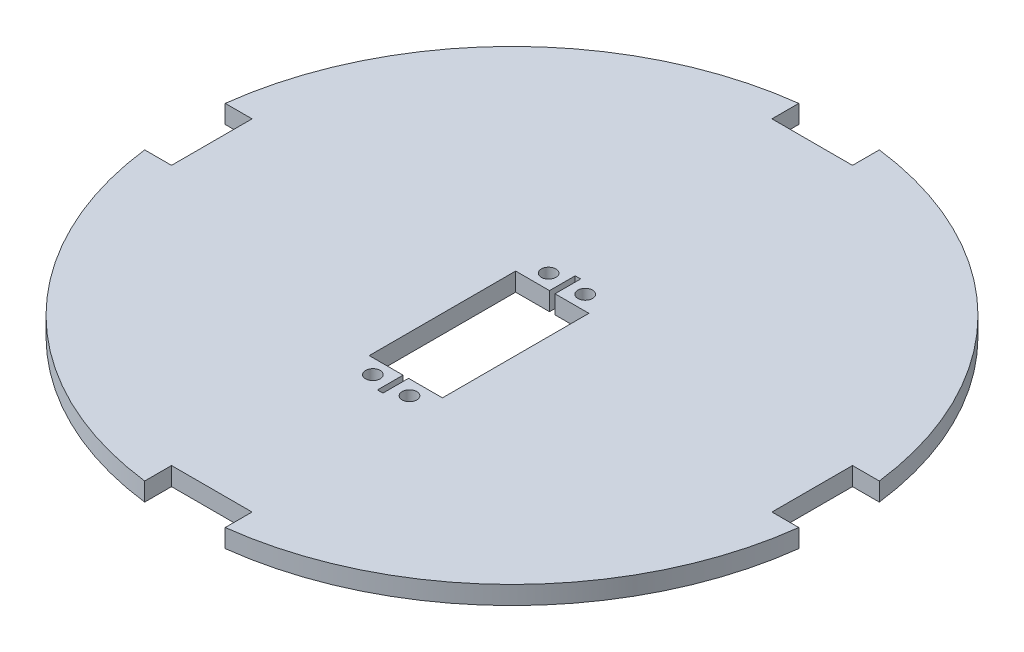
ISO-10303-21;
HEADER;
FILE_DESCRIPTION(('STEP AP214'),'2;1');
FILE_NAME('part.step','',(''),(''),'','','');
FILE_SCHEMA(('AUTOMOTIVE_DESIGN { 1 0 10303 214 1 1 1 1 }'));
ENDSEC;
DATA;
#1=APPLICATION_CONTEXT('core data for automotive mechanical design processes');
#2=APPLICATION_PROTOCOL_DEFINITION('international standard','automotive_design',2000,#1);
#3=PRODUCT_CONTEXT('',#1,'mechanical');
#4=PRODUCT('Part','Part','',(#3));
#5=PRODUCT_RELATED_PRODUCT_CATEGORY('part','',(#4));
#6=PRODUCT_DEFINITION_FORMATION('','',#4);
#7=PRODUCT_DEFINITION_CONTEXT('part definition',#1,'design');
#8=PRODUCT_DEFINITION('design','',#6,#7);
#9=PRODUCT_DEFINITION_SHAPE('','',#8);
#10=(LENGTH_UNIT() NAMED_UNIT(*) SI_UNIT(.MILLI.,.METRE.));
#11=(NAMED_UNIT(*) PLANE_ANGLE_UNIT() SI_UNIT($,.RADIAN.));
#12=(NAMED_UNIT(*) SI_UNIT($,.STERADIAN.) SOLID_ANGLE_UNIT());
#13=UNCERTAINTY_MEASURE_WITH_UNIT(LENGTH_MEASURE(1.E-05),#10,'distance_accuracy_value','');
#14=(GEOMETRIC_REPRESENTATION_CONTEXT(3) GLOBAL_UNCERTAINTY_ASSIGNED_CONTEXT((#13)) GLOBAL_UNIT_ASSIGNED_CONTEXT((#10,
#11,#12)) REPRESENTATION_CONTEXT('',''));
#15=CARTESIAN_POINT('',(0.,0.,0.));
#16=DIRECTION('',(0.,0.,1.));
#17=DIRECTION('',(1.,0.,0.));
#18=AXIS2_PLACEMENT_3D('',#15,#16,#17);
#19=CARTESIAN_POINT('',(0.,5.,0.));
#20=DIRECTION('',(0.,1.,0.));
#21=DIRECTION('',(0.,0.,1.));
#22=AXIS2_PLACEMENT_3D('',#19,#20,#21);
#23=PLANE('',#22);
#24=CARTESIAN_POINT('',(-5.,5.,33.));
#25=DIRECTION('',(0.,1.,0.));
#26=DIRECTION('',(0.,0.,1.));
#27=AXIS2_PLACEMENT_3D('',#24,#25,#26);
#28=CIRCLE('',#27,2.);
#29=CARTESIAN_POINT('',(-5.,5.,35.));
#30=VERTEX_POINT('',#29);
#31=EDGE_CURVE('E441',#30,#30,#28,.F.);
#32=ORIENTED_EDGE('',*,*,#31,.T.);
#33=EDGE_LOOP('',(#32));
#34=FACE_BOUND('',#33,.T.);
#35=DIRECTION('',(1.,0.,0.));
#36=VECTOR('',#35,1.);
#37=CARTESIAN_POINT('',(0.,5.,-11.));
#38=LINE('',#37,#36);
#39=CARTESIAN_POINT('',(0.749999999999998,5.,-11.));
#40=VERTEX_POINT('',#39);
#41=CARTESIAN_POINT('',(10.,5.,-11.));
#42=VERTEX_POINT('',#41);
#43=EDGE_CURVE('E388',#40,#42,#38,.T.);
#44=ORIENTED_EDGE('',*,*,#43,.T.);
#45=DIRECTION('',(0.,0.,1.));
#46=VECTOR('',#45,1.);
#47=CARTESIAN_POINT('',(10.,5.,0.));
#48=LINE('',#47,#46);
#49=CARTESIAN_POINT('',(10.,5.,29.));
#50=VERTEX_POINT('',#49);
#51=EDGE_CURVE('E207',#42,#50,#48,.T.);
#52=ORIENTED_EDGE('',*,*,#51,.T.);
#53=DIRECTION('',(1.,0.,0.));
#54=VECTOR('',#53,1.);
#55=CARTESIAN_POINT('',(0.,5.,29.));
#56=LINE('',#55,#54);
#57=CARTESIAN_POINT('',(0.750000000000012,5.,29.));
#58=VERTEX_POINT('',#57);
#59=EDGE_CURVE('E411',#58,#50,#56,.T.);
#60=ORIENTED_EDGE('',*,*,#59,.F.);
#61=DIRECTION('',(0.,0.,-1.));
#62=VECTOR('',#61,1.);
#63=CARTESIAN_POINT('',(0.74999999999997,5.,0.));
#64=LINE('',#63,#62);
#65=CARTESIAN_POINT('',(0.750000000000016,5.,36.));
#66=VERTEX_POINT('',#65);
#67=EDGE_CURVE('E417',#66,#58,#64,.T.);
#68=ORIENTED_EDGE('',*,*,#67,.F.);
#69=DIRECTION('',(1.,0.,0.));
#70=VECTOR('',#69,1.);
#71=CARTESIAN_POINT('',(0.,5.,36.));
#72=LINE('',#71,#70);
#73=CARTESIAN_POINT('',(-0.750000000000003,5.,36.));
#74=VERTEX_POINT('',#73);
#75=EDGE_CURVE('E414',#74,#66,#72,.T.);
#76=ORIENTED_EDGE('',*,*,#75,.F.);
#77=DIRECTION('',(0.,0.,-1.));
#78=VECTOR('',#77,1.);
#79=CARTESIAN_POINT('',(-0.749999999999999,5.,0.));
#80=LINE('',#79,#78);
#81=CARTESIAN_POINT('',(-0.750000000000003,5.,29.));
#82=VERTEX_POINT('',#81);
#83=EDGE_CURVE('E410',#74,#82,#80,.T.);
#84=ORIENTED_EDGE('',*,*,#83,.T.);
#85=CARTESIAN_POINT('',(-9.99999999999999,5.,29.));
#86=VERTEX_POINT('',#85);
#87=EDGE_CURVE('E407',#86,#82,#56,.T.);
#88=ORIENTED_EDGE('',*,*,#87,.F.);
#89=DIRECTION('',(0.,0.,1.));
#90=VECTOR('',#89,1.);
#91=CARTESIAN_POINT('',(-9.99999999999999,5.,0.));
#92=LINE('',#91,#90);
#93=CARTESIAN_POINT('',(-9.99999999999999,5.,-11.));
#94=VERTEX_POINT('',#93);
#95=EDGE_CURVE('E404',#94,#86,#92,.T.);
#96=ORIENTED_EDGE('',*,*,#95,.F.);
#97=CARTESIAN_POINT('',(-0.750000000000003,5.,-11.));
#98=VERTEX_POINT('',#97);
#99=EDGE_CURVE('E392',#94,#98,#38,.T.);
#100=ORIENTED_EDGE('',*,*,#99,.T.);
#101=DIRECTION('',(0.,0.,1.));
#102=VECTOR('',#101,1.);
#103=CARTESIAN_POINT('',(-0.750000000000001,5.,0.));
#104=LINE('',#103,#102);
#105=CARTESIAN_POINT('',(-0.750000000000003,5.,-18.));
#106=VERTEX_POINT('',#105);
#107=EDGE_CURVE('E398',#106,#98,#104,.T.);
#108=ORIENTED_EDGE('',*,*,#107,.F.);
#109=DIRECTION('',(1.,0.,0.));
#110=VECTOR('',#109,1.);
#111=CARTESIAN_POINT('',(0.,5.,-18.));
#112=LINE('',#111,#110);
#113=CARTESIAN_POINT('',(0.749999999999997,5.,-18.));
#114=VERTEX_POINT('',#113);
#115=EDGE_CURVE('E396',#106,#114,#112,.T.);
#116=ORIENTED_EDGE('',*,*,#115,.T.);
#117=DIRECTION('',(0.,0.,1.));
#118=VECTOR('',#117,1.);
#119=CARTESIAN_POINT('',(0.749999999999999,5.,0.));
#120=LINE('',#119,#118);
#121=EDGE_CURVE('E379',#114,#40,#120,.T.);
#122=ORIENTED_EDGE('',*,*,#121,.T.);
#123=EDGE_LOOP('',(#44,#52,#60,#68,#76,#84,#88,#96,#100,#108,#116,#122));
#124=FACE_BOUND('',#123,.T.);
#125=CARTESIAN_POINT('',(4.99999999999999,5.,33.));
#126=DIRECTION('',(0.,1.,0.));
#127=DIRECTION('',(0.,0.,1.));
#128=AXIS2_PLACEMENT_3D('',#125,#126,#127);
#129=CIRCLE('',#128,2.);
#130=CARTESIAN_POINT('',(4.99999999999999,5.,35.));
#131=VERTEX_POINT('',#130);
#132=EDGE_CURVE('E444',#131,#131,#129,.F.);
#133=ORIENTED_EDGE('',*,*,#132,.T.);
#134=EDGE_LOOP('',(#133));
#135=FACE_BOUND('',#134,.T.);
#136=DIRECTION('',(-1.,0.,0.));
#137=VECTOR('',#136,1.);
#138=CARTESIAN_POINT('',(-82.,5.,-10.9999999999997));
#139=LINE('',#138,#137);
#140=CARTESIAN_POINT('',(-82.,5.,-10.9999999999997));
#141=VERTEX_POINT('',#140);
#142=CARTESIAN_POINT('',(-89.3252483903628,5.,-10.9999999999997));
#143=VERTEX_POINT('',#142);
#144=EDGE_CURVE('E450',#141,#143,#139,.T.);
#145=ORIENTED_EDGE('',*,*,#144,.F.);
#146=DIRECTION('',(0.,0.,-1.));
#147=VECTOR('',#146,1.);
#148=CARTESIAN_POINT('',(-82.,5.,11.0000000000003));
#149=LINE('',#148,#147);
#150=CARTESIAN_POINT('',(-82.,5.,11.0000000000003));
#151=VERTEX_POINT('',#150);
#152=EDGE_CURVE('E456',#151,#141,#149,.T.);
#153=ORIENTED_EDGE('',*,*,#152,.F.);
#154=DIRECTION('',(1.,0.,0.));
#155=VECTOR('',#154,1.);
#156=CARTESIAN_POINT('',(-82.,5.,11.0000000000003));
#157=LINE('',#156,#155);
#158=CARTESIAN_POINT('',(-89.3252483903627,5.,11.0000000000003));
#159=VERTEX_POINT('',#158);
#160=EDGE_CURVE('E452',#159,#151,#157,.T.);
#161=ORIENTED_EDGE('',*,*,#160,.F.);
#162=CARTESIAN_POINT('',(0.,5.,0.));
#163=DIRECTION('',(0.,1.,0.));
#164=DIRECTION('',(0.,0.,1.));
#165=AXIS2_PLACEMENT_3D('',#162,#163,#164);
#166=CIRCLE('',#165,90.);
#167=CARTESIAN_POINT('',(-11.,5.,89.3252483903627));
#168=VERTEX_POINT('',#167);
#169=EDGE_CURVE('E528',#159,#168,#166,.T.);
#170=ORIENTED_EDGE('',*,*,#169,.T.);
#171=DIRECTION('',(0.,0.,1.));
#172=VECTOR('',#171,1.);
#173=CARTESIAN_POINT('',(-11.,5.,82.));
#174=LINE('',#173,#172);
#175=CARTESIAN_POINT('',(-11.,5.,82.));
#176=VERTEX_POINT('',#175);
#177=EDGE_CURVE('E464',#176,#168,#174,.T.);
#178=ORIENTED_EDGE('',*,*,#177,.F.);
#179=DIRECTION('',(-1.,0.,0.));
#180=VECTOR('',#179,1.);
#181=CARTESIAN_POINT('',(11.,5.,82.));
#182=LINE('',#181,#180);
#183=CARTESIAN_POINT('',(11.,5.,82.));
#184=VERTEX_POINT('',#183);
#185=EDGE_CURVE('E470',#184,#176,#182,.T.);
#186=ORIENTED_EDGE('',*,*,#185,.F.);
#187=DIRECTION('',(0.,0.,-1.));
#188=VECTOR('',#187,1.);
#189=CARTESIAN_POINT('',(11.,5.,82.));
#190=LINE('',#189,#188);
#191=CARTESIAN_POINT('',(11.,5.,89.3252483903627));
#192=VERTEX_POINT('',#191);
#193=EDGE_CURVE('E466',#192,#184,#190,.T.);
#194=ORIENTED_EDGE('',*,*,#193,.F.);
#195=CARTESIAN_POINT('',(89.3252483903628,5.,10.9999999999991));
#196=VERTEX_POINT('',#195);
#197=EDGE_CURVE('E666',#192,#196,#166,.T.);
#198=ORIENTED_EDGE('',*,*,#197,.T.);
#199=DIRECTION('',(1.,0.,0.));
#200=VECTOR('',#199,1.);
#201=CARTESIAN_POINT('',(82.0000000000001,5.,10.9999999999991));
#202=LINE('',#201,#200);
#203=CARTESIAN_POINT('',(82.0000000000001,5.,10.9999999999991));
#204=VERTEX_POINT('',#203);
#205=EDGE_CURVE('E476',#204,#196,#202,.T.);
#206=ORIENTED_EDGE('',*,*,#205,.F.);
#207=DIRECTION('',(0.,0.,1.));
#208=VECTOR('',#207,1.);
#209=CARTESIAN_POINT('',(81.9999999999999,5.,-11.0000000000009));
#210=LINE('',#209,#208);
#211=CARTESIAN_POINT('',(81.9999999999999,5.,-11.0000000000009));
#212=VERTEX_POINT('',#211);
#213=EDGE_CURVE('E481',#212,#204,#210,.T.);
#214=ORIENTED_EDGE('',*,*,#213,.F.);
#215=DIRECTION('',(-1.,0.,0.));
#216=VECTOR('',#215,1.);
#217=CARTESIAN_POINT('',(81.9999999999999,5.,-11.0000000000009));
#218=LINE('',#217,#216);
#219=CARTESIAN_POINT('',(89.3252483903626,5.,-11.0000000000009));
#220=VERTEX_POINT('',#219);
#221=EDGE_CURVE('E478',#220,#212,#218,.T.);
#222=ORIENTED_EDGE('',*,*,#221,.F.);
#223=CARTESIAN_POINT('',(11.,5.,-89.3252483903627));
#224=VERTEX_POINT('',#223);
#225=EDGE_CURVE('E529',#220,#224,#166,.T.);
#226=ORIENTED_EDGE('',*,*,#225,.T.);
#227=DIRECTION('',(0.,0.,-1.));
#228=VECTOR('',#227,1.);
#229=CARTESIAN_POINT('',(11.,5.,-82.));
#230=LINE('',#229,#228);
#231=CARTESIAN_POINT('',(11.,5.,-82.));
#232=VERTEX_POINT('',#231);
#233=EDGE_CURVE('E504',#232,#224,#230,.T.);
#234=ORIENTED_EDGE('',*,*,#233,.F.);
#235=DIRECTION('',(1.,0.,0.));
#236=VECTOR('',#235,1.);
#237=CARTESIAN_POINT('',(-11.,5.,-82.));
#238=LINE('',#237,#236);
#239=CARTESIAN_POINT('',(-11.,5.,-82.));
#240=VERTEX_POINT('',#239);
#241=EDGE_CURVE('E510',#240,#232,#238,.T.);
#242=ORIENTED_EDGE('',*,*,#241,.F.);
#243=DIRECTION('',(0.,0.,1.));
#244=VECTOR('',#243,1.);
#245=CARTESIAN_POINT('',(-11.,5.,-82.));
#246=LINE('',#245,#244);
#247=CARTESIAN_POINT('',(-11.,5.,-89.3252483903627));
#248=VERTEX_POINT('',#247);
#249=EDGE_CURVE('E507',#248,#240,#246,.T.);
#250=ORIENTED_EDGE('',*,*,#249,.F.);
#251=EDGE_CURVE('E524',#248,#143,#166,.T.);
#252=ORIENTED_EDGE('',*,*,#251,.T.);
#253=EDGE_LOOP('',(#145,#153,#161,#170,#178,#186,#194,#198,#206,#214,#222,#226,#234,#242,#250,#252));
#254=FACE_BOUND('',#253,.T.);
#255=CARTESIAN_POINT('',(4.99999999999999,5.,-15.));
#256=DIRECTION('',(0.,1.,0.));
#257=DIRECTION('',(0.,0.,1.));
#258=AXIS2_PLACEMENT_3D('',#255,#256,#257);
#259=CIRCLE('',#258,2.);
#260=CARTESIAN_POINT('',(4.99999999999999,5.,-13.));
#261=VERTEX_POINT('',#260);
#262=EDGE_CURVE('E925',#261,#261,#259,.T.);
#263=ORIENTED_EDGE('',*,*,#262,.F.);
#264=EDGE_LOOP('',(#263));
#265=FACE_BOUND('',#264,.T.);
#266=CARTESIAN_POINT('',(-5.,5.,-15.));
#267=DIRECTION('',(0.,1.,0.));
#268=DIRECTION('',(0.,0.,1.));
#269=AXIS2_PLACEMENT_3D('',#266,#267,#268);
#270=CIRCLE('',#269,2.);
#271=CARTESIAN_POINT('',(-5.,5.,-13.));
#272=VERTEX_POINT('',#271);
#273=EDGE_CURVE('E422',#272,#272,#270,.T.);
#274=ORIENTED_EDGE('',*,*,#273,.F.);
#275=EDGE_LOOP('',(#274));
#276=FACE_BOUND('',#275,.T.);
#277=ADVANCED_FACE('F190',(#34,#124,#135,#254,#265,#276),#23,.T.);
#278=CARTESIAN_POINT('',(0.,0.,0.));
#279=DIRECTION('',(0.,1.,0.));
#280=DIRECTION('',(0.,0.,1.));
#281=AXIS2_PLACEMENT_3D('',#278,#279,#280);
#282=PLANE('',#281);
#283=CARTESIAN_POINT('',(-5.,0.,33.));
#284=DIRECTION('',(0.,1.,0.));
#285=DIRECTION('',(0.,0.,1.));
#286=AXIS2_PLACEMENT_3D('',#283,#284,#285);
#287=CIRCLE('',#286,2.);
#288=CARTESIAN_POINT('',(-5.,0.,35.));
#289=VERTEX_POINT('',#288);
#290=EDGE_CURVE('E194',#289,#289,#287,.F.);
#291=ORIENTED_EDGE('',*,*,#290,.F.);
#292=EDGE_LOOP('',(#291));
#293=FACE_BOUND('',#292,.T.);
#294=CARTESIAN_POINT('',(4.99999999999999,0.,-15.));
#295=DIRECTION('',(0.,1.,0.));
#296=DIRECTION('',(0.,0.,1.));
#297=AXIS2_PLACEMENT_3D('',#294,#295,#296);
#298=CIRCLE('',#297,2.);
#299=CARTESIAN_POINT('',(4.99999999999999,0.,-13.));
#300=VERTEX_POINT('',#299);
#301=EDGE_CURVE('E572',#300,#300,#298,.T.);
#302=ORIENTED_EDGE('',*,*,#301,.T.);
#303=EDGE_LOOP('',(#302));
#304=FACE_BOUND('',#303,.T.);
#305=DIRECTION('',(0.,0.,1.));
#306=VECTOR('',#305,1.);
#307=CARTESIAN_POINT('',(10.,0.,0.));
#308=LINE('',#307,#306);
#309=CARTESIAN_POINT('',(10.,0.,-11.));
#310=VERTEX_POINT('',#309);
#311=CARTESIAN_POINT('',(10.,0.,29.));
#312=VERTEX_POINT('',#311);
#313=EDGE_CURVE('E12',#310,#312,#308,.T.);
#314=ORIENTED_EDGE('',*,*,#313,.F.);
#315=DIRECTION('',(1.,0.,0.));
#316=VECTOR('',#315,1.);
#317=CARTESIAN_POINT('',(0.,0.,-11.));
#318=LINE('',#317,#316);
#319=CARTESIAN_POINT('',(0.749999999999998,0.,-11.));
#320=VERTEX_POINT('',#319);
#321=EDGE_CURVE('E569',#320,#310,#318,.T.);
#322=ORIENTED_EDGE('',*,*,#321,.F.);
#323=DIRECTION('',(0.,0.,1.));
#324=VECTOR('',#323,1.);
#325=CARTESIAN_POINT('',(0.749999999999999,0.,0.));
#326=LINE('',#325,#324);
#327=CARTESIAN_POINT('',(0.749999999999997,0.,-18.));
#328=VERTEX_POINT('',#327);
#329=EDGE_CURVE('E382',#328,#320,#326,.T.);
#330=ORIENTED_EDGE('',*,*,#329,.F.);
#331=DIRECTION('',(1.,0.,0.));
#332=VECTOR('',#331,1.);
#333=CARTESIAN_POINT('',(0.,0.,-18.));
#334=LINE('',#333,#332);
#335=CARTESIAN_POINT('',(-0.750000000000003,0.,-18.));
#336=VERTEX_POINT('',#335);
#337=EDGE_CURVE('E575',#336,#328,#334,.T.);
#338=ORIENTED_EDGE('',*,*,#337,.F.);
#339=DIRECTION('',(0.,0.,1.));
#340=VECTOR('',#339,1.);
#341=CARTESIAN_POINT('',(-0.750000000000001,0.,0.));
#342=LINE('',#341,#340);
#343=CARTESIAN_POINT('',(-0.750000000000003,0.,-11.));
#344=VERTEX_POINT('',#343);
#345=EDGE_CURVE('E577',#336,#344,#342,.T.);
#346=ORIENTED_EDGE('',*,*,#345,.T.);
#347=DIRECTION('',(1.,0.,0.));
#348=VECTOR('',#347,1.);
#349=CARTESIAN_POINT('',(0.,0.,-11.));
#350=LINE('',#349,#348);
#351=CARTESIAN_POINT('',(-9.99999999999999,0.,-11.));
#352=VERTEX_POINT('',#351);
#353=EDGE_CURVE('E580',#352,#344,#350,.T.);
#354=ORIENTED_EDGE('',*,*,#353,.F.);
#355=DIRECTION('',(0.,0.,1.));
#356=VECTOR('',#355,1.);
#357=CARTESIAN_POINT('',(-9.99999999999999,0.,0.));
#358=LINE('',#357,#356);
#359=CARTESIAN_POINT('',(-9.99999999999999,0.,29.));
#360=VERTEX_POINT('',#359);
#361=EDGE_CURVE('E582',#352,#360,#358,.T.);
#362=ORIENTED_EDGE('',*,*,#361,.T.);
#363=DIRECTION('',(1.,0.,0.));
#364=VECTOR('',#363,1.);
#365=CARTESIAN_POINT('',(0.,0.,29.));
#366=LINE('',#365,#364);
#367=CARTESIAN_POINT('',(-0.750000000000003,0.,29.));
#368=VERTEX_POINT('',#367);
#369=EDGE_CURVE('E585',#360,#368,#366,.T.);
#370=ORIENTED_EDGE('',*,*,#369,.T.);
#371=DIRECTION('',(0.,0.,-1.));
#372=VECTOR('',#371,1.);
#373=CARTESIAN_POINT('',(-0.749999999999999,0.,0.));
#374=LINE('',#373,#372);
#375=CARTESIAN_POINT('',(-0.750000000000003,0.,36.));
#376=VERTEX_POINT('',#375);
#377=EDGE_CURVE('E588',#376,#368,#374,.T.);
#378=ORIENTED_EDGE('',*,*,#377,.F.);
#379=DIRECTION('',(1.,0.,0.));
#380=VECTOR('',#379,1.);
#381=CARTESIAN_POINT('',(0.,0.,36.));
#382=LINE('',#381,#380);
#383=CARTESIAN_POINT('',(0.750000000000016,0.,36.));
#384=VERTEX_POINT('',#383);
#385=EDGE_CURVE('E590',#376,#384,#382,.T.);
#386=ORIENTED_EDGE('',*,*,#385,.T.);
#387=DIRECTION('',(0.,0.,-1.));
#388=VECTOR('',#387,1.);
#389=CARTESIAN_POINT('',(0.74999999999997,0.,0.));
#390=LINE('',#389,#388);
#391=CARTESIAN_POINT('',(0.750000000000012,0.,29.));
#392=VERTEX_POINT('',#391);
#393=EDGE_CURVE('E593',#384,#392,#390,.T.);
#394=ORIENTED_EDGE('',*,*,#393,.T.);
#395=DIRECTION('',(1.,0.,0.));
#396=VECTOR('',#395,1.);
#397=CARTESIAN_POINT('',(0.,0.,29.));
#398=LINE('',#397,#396);
#399=EDGE_CURVE('E199',#392,#312,#398,.T.);
#400=ORIENTED_EDGE('',*,*,#399,.T.);
#401=EDGE_LOOP('',(#314,#322,#330,#338,#346,#354,#362,#370,#378,#386,#394,#400));
#402=FACE_BOUND('',#401,.T.);
#403=CARTESIAN_POINT('',(4.99999999999999,0.,33.));
#404=DIRECTION('',(0.,1.,0.));
#405=DIRECTION('',(0.,0.,1.));
#406=AXIS2_PLACEMENT_3D('',#403,#404,#405);
#407=CIRCLE('',#406,2.);
#408=CARTESIAN_POINT('',(4.99999999999999,0.,35.));
#409=VERTEX_POINT('',#408);
#410=EDGE_CURVE('E449',#409,#409,#407,.F.);
#411=ORIENTED_EDGE('',*,*,#410,.F.);
#412=EDGE_LOOP('',(#411));
#413=FACE_BOUND('',#412,.T.);
#414=DIRECTION('',(0.,0.,-1.));
#415=VECTOR('',#414,1.);
#416=CARTESIAN_POINT('',(-82.,0.,2.86301469785137E-13));
#417=LINE('',#416,#415);
#418=CARTESIAN_POINT('',(-82.,0.,11.0000000000003));
#419=VERTEX_POINT('',#418);
#420=CARTESIAN_POINT('',(-82.,0.,-10.9999999999997));
#421=VERTEX_POINT('',#420);
#422=EDGE_CURVE('E563',#419,#421,#417,.T.);
#423=ORIENTED_EDGE('',*,*,#422,.T.);
#424=DIRECTION('',(-1.,0.,0.));
#425=VECTOR('',#424,1.);
#426=CARTESIAN_POINT('',(0.,0.,-11.));
#427=LINE('',#426,#425);
#428=CARTESIAN_POINT('',(-89.3252483903628,0.,-10.9999999999997));
#429=VERTEX_POINT('',#428);
#430=EDGE_CURVE('E566',#421,#429,#427,.T.);
#431=ORIENTED_EDGE('',*,*,#430,.T.);
#432=CARTESIAN_POINT('',(0.,0.,0.));
#433=DIRECTION('',(0.,1.,0.));
#434=DIRECTION('',(0.,0.,1.));
#435=AXIS2_PLACEMENT_3D('',#432,#433,#434);
#436=CIRCLE('',#435,90.);
#437=CARTESIAN_POINT('',(-11.,0.,-89.3252483903627));
#438=VERTEX_POINT('',#437);
#439=EDGE_CURVE('E530',#438,#429,#436,.T.);
#440=ORIENTED_EDGE('',*,*,#439,.F.);
#441=DIRECTION('',(0.,0.,1.));
#442=VECTOR('',#441,1.);
#443=CARTESIAN_POINT('',(-11.,0.,0.));
#444=LINE('',#443,#442);
#445=CARTESIAN_POINT('',(-11.,0.,-82.));
#446=VERTEX_POINT('',#445);
#447=EDGE_CURVE('E527',#438,#446,#444,.T.);
#448=ORIENTED_EDGE('',*,*,#447,.T.);
#449=DIRECTION('',(1.,0.,0.));
#450=VECTOR('',#449,1.);
#451=CARTESIAN_POINT('',(0.,0.,-82.));
#452=LINE('',#451,#450);
#453=CARTESIAN_POINT('',(11.,0.,-82.));
#454=VERTEX_POINT('',#453);
#455=EDGE_CURVE('E536',#446,#454,#452,.T.);
#456=ORIENTED_EDGE('',*,*,#455,.T.);
#457=DIRECTION('',(0.,0.,-1.));
#458=VECTOR('',#457,1.);
#459=CARTESIAN_POINT('',(11.,0.,0.));
#460=LINE('',#459,#458);
#461=CARTESIAN_POINT('',(11.,0.,-89.3252483903627));
#462=VERTEX_POINT('',#461);
#463=EDGE_CURVE('E539',#454,#462,#460,.T.);
#464=ORIENTED_EDGE('',*,*,#463,.T.);
#465=CARTESIAN_POINT('',(89.3252483903626,0.,-11.0000000000009));
#466=VERTEX_POINT('',#465);
#467=EDGE_CURVE('E523',#466,#462,#436,.T.);
#468=ORIENTED_EDGE('',*,*,#467,.F.);
#469=DIRECTION('',(-1.,0.,0.));
#470=VECTOR('',#469,1.);
#471=CARTESIAN_POINT('',(-1.15218884181823E-13,0.,-11.));
#472=LINE('',#471,#470);
#473=CARTESIAN_POINT('',(81.9999999999999,0.,-11.0000000000009));
#474=VERTEX_POINT('',#473);
#475=EDGE_CURVE('E542',#466,#474,#472,.T.);
#476=ORIENTED_EDGE('',*,*,#475,.T.);
#477=DIRECTION('',(0.,0.,1.));
#478=VECTOR('',#477,1.);
#479=CARTESIAN_POINT('',(82.,0.,-8.58904409355411E-13));
#480=LINE('',#479,#478);
#481=CARTESIAN_POINT('',(82.0000000000001,0.,10.9999999999991));
#482=VERTEX_POINT('',#481);
#483=EDGE_CURVE('E545',#474,#482,#480,.T.);
#484=ORIENTED_EDGE('',*,*,#483,.T.);
#485=DIRECTION('',(1.,0.,0.));
#486=VECTOR('',#485,1.);
#487=CARTESIAN_POINT('',(1.15218884181823E-13,0.,11.));
#488=LINE('',#487,#486);
#489=CARTESIAN_POINT('',(89.3252483903628,0.,10.9999999999991));
#490=VERTEX_POINT('',#489);
#491=EDGE_CURVE('E548',#482,#490,#488,.T.);
#492=ORIENTED_EDGE('',*,*,#491,.T.);
#493=CARTESIAN_POINT('',(11.,0.,89.3252483903627));
#494=VERTEX_POINT('',#493);
#495=EDGE_CURVE('E647',#494,#490,#436,.T.);
#496=ORIENTED_EDGE('',*,*,#495,.F.);
#497=DIRECTION('',(0.,0.,-1.));
#498=VECTOR('',#497,1.);
#499=CARTESIAN_POINT('',(11.,0.,0.));
#500=LINE('',#499,#498);
#501=CARTESIAN_POINT('',(11.,0.,82.));
#502=VERTEX_POINT('',#501);
#503=EDGE_CURVE('E551',#494,#502,#500,.T.);
#504=ORIENTED_EDGE('',*,*,#503,.T.);
#505=DIRECTION('',(-1.,0.,0.));
#506=VECTOR('',#505,1.);
#507=CARTESIAN_POINT('',(0.,0.,82.));
#508=LINE('',#507,#506);
#509=CARTESIAN_POINT('',(-11.,0.,82.));
#510=VERTEX_POINT('',#509);
#511=EDGE_CURVE('E554',#502,#510,#508,.T.);
#512=ORIENTED_EDGE('',*,*,#511,.T.);
#513=DIRECTION('',(0.,0.,1.));
#514=VECTOR('',#513,1.);
#515=CARTESIAN_POINT('',(-11.,0.,0.));
#516=LINE('',#515,#514);
#517=CARTESIAN_POINT('',(-11.,0.,89.3252483903627));
#518=VERTEX_POINT('',#517);
#519=EDGE_CURVE('E557',#510,#518,#516,.T.);
#520=ORIENTED_EDGE('',*,*,#519,.T.);
#521=CARTESIAN_POINT('',(-89.3252483903627,0.,11.0000000000003));
#522=VERTEX_POINT('',#521);
#523=EDGE_CURVE('E533',#522,#518,#436,.T.);
#524=ORIENTED_EDGE('',*,*,#523,.F.);
#525=DIRECTION('',(1.,0.,0.));
#526=VECTOR('',#525,1.);
#527=CARTESIAN_POINT('',(0.,0.,11.));
#528=LINE('',#527,#526);
#529=EDGE_CURVE('E560',#522,#419,#528,.T.);
#530=ORIENTED_EDGE('',*,*,#529,.T.);
#531=EDGE_LOOP('',(#423,#431,#440,#448,#456,#464,#468,#476,#484,#492,#496,#504,#512,#520,#524,#530));
#532=FACE_BOUND('',#531,.T.);
#533=CARTESIAN_POINT('',(-5.,0.,-15.));
#534=DIRECTION('',(0.,1.,0.));
#535=DIRECTION('',(0.,0.,1.));
#536=AXIS2_PLACEMENT_3D('',#533,#534,#535);
#537=CIRCLE('',#536,2.);
#538=CARTESIAN_POINT('',(-5.,0.,-13.));
#539=VERTEX_POINT('',#538);
#540=EDGE_CURVE('E599',#539,#539,#537,.T.);
#541=ORIENTED_EDGE('',*,*,#540,.T.);
#542=EDGE_LOOP('',(#541));
#543=FACE_BOUND('',#542,.T.);
#544=ADVANCED_FACE('F608',(#293,#304,#402,#413,#532,#543),#282,.F.);
#545=CARTESIAN_POINT('',(0.,5.,0.));
#546=DIRECTION('',(0.,-1.,0.));
#547=DIRECTION('',(0.,0.,-1.));
#548=AXIS2_PLACEMENT_3D('',#545,#546,#547);
#549=CYLINDRICAL_SURFACE('',#548,90.);
#550=ORIENTED_EDGE('',*,*,#439,.T.);
#551=DIRECTION('',(0.,-1.,0.));
#552=VECTOR('',#551,1.);
#553=CARTESIAN_POINT('',(-89.3252483903628,5.,-10.9999999999997));
#554=LINE('',#553,#552);
#555=EDGE_CURVE('E501',#429,#143,#554,.F.);
#556=ORIENTED_EDGE('',*,*,#555,.T.);
#557=ORIENTED_EDGE('',*,*,#251,.F.);
#558=DIRECTION('',(0.,-1.,0.));
#559=VECTOR('',#558,1.);
#560=CARTESIAN_POINT('',(-11.,5.,-89.3252483903627));
#561=LINE('',#560,#559);
#562=EDGE_CURVE('E516',#248,#438,#561,.T.);
#563=ORIENTED_EDGE('',*,*,#562,.T.);
#564=EDGE_LOOP('',(#550,#556,#557,#563));
#565=FACE_BOUND('',#564,.T.);
#566=ADVANCED_FACE('F611',(#565),#549,.T.);
#567=ORIENTED_EDGE('',*,*,#169,.F.);
#568=DIRECTION('',(0.,-1.,0.));
#569=VECTOR('',#568,1.);
#570=CARTESIAN_POINT('',(-89.3252483903627,5.,11.0000000000003));
#571=LINE('',#570,#569);
#572=EDGE_CURVE('E498',#159,#522,#571,.T.);
#573=ORIENTED_EDGE('',*,*,#572,.T.);
#574=ORIENTED_EDGE('',*,*,#523,.T.);
#575=DIRECTION('',(0.,-1.,0.));
#576=VECTOR('',#575,1.);
#577=CARTESIAN_POINT('',(-11.,5.,89.3252483903627));
#578=LINE('',#577,#576);
#579=EDGE_CURVE('E495',#518,#168,#578,.F.);
#580=ORIENTED_EDGE('',*,*,#579,.T.);
#581=EDGE_LOOP('',(#567,#573,#574,#580));
#582=FACE_BOUND('',#581,.T.);
#583=ADVANCED_FACE('F654',(#582),#549,.T.);
#584=ORIENTED_EDGE('',*,*,#197,.F.);
#585=DIRECTION('',(0.,-1.,0.));
#586=VECTOR('',#585,1.);
#587=CARTESIAN_POINT('',(11.,5.,89.3252483903627));
#588=LINE('',#587,#586);
#589=EDGE_CURVE('E492',#192,#494,#588,.T.);
#590=ORIENTED_EDGE('',*,*,#589,.T.);
#591=ORIENTED_EDGE('',*,*,#495,.T.);
#592=DIRECTION('',(0.,-1.,0.));
#593=VECTOR('',#592,1.);
#594=CARTESIAN_POINT('',(89.3252483903628,5.,10.9999999999991));
#595=LINE('',#594,#593);
#596=EDGE_CURVE('E489',#490,#196,#595,.F.);
#597=ORIENTED_EDGE('',*,*,#596,.T.);
#598=EDGE_LOOP('',(#584,#590,#591,#597));
#599=FACE_BOUND('',#598,.T.);
#600=ADVANCED_FACE('F680',(#599),#549,.T.);
#601=ORIENTED_EDGE('',*,*,#225,.F.);
#602=DIRECTION('',(0.,-1.,0.));
#603=VECTOR('',#602,1.);
#604=CARTESIAN_POINT('',(89.3252483903626,5.,-11.0000000000009));
#605=LINE('',#604,#603);
#606=EDGE_CURVE('E462',#220,#466,#605,.T.);
#607=ORIENTED_EDGE('',*,*,#606,.T.);
#608=ORIENTED_EDGE('',*,*,#467,.T.);
#609=DIRECTION('',(0.,-1.,0.));
#610=VECTOR('',#609,1.);
#611=CARTESIAN_POINT('',(11.,5.,-89.3252483903627));
#612=LINE('',#611,#610);
#613=EDGE_CURVE('E520',#462,#224,#612,.F.);
#614=ORIENTED_EDGE('',*,*,#613,.T.);
#615=EDGE_LOOP('',(#601,#607,#608,#614));
#616=FACE_BOUND('',#615,.T.);
#617=ADVANCED_FACE('F192',(#616),#549,.T.);
#618=CARTESIAN_POINT('',(11.,-5.,-82.));
#619=DIRECTION('',(1.,0.,0.));
#620=DIRECTION('',(0.,0.,-1.));
#621=AXIS2_PLACEMENT_3D('',#618,#619,#620);
#622=PLANE('',#621);
#623=ORIENTED_EDGE('',*,*,#463,.F.);
#624=DIRECTION('',(0.,1.,0.));
#625=VECTOR('',#624,1.);
#626=CARTESIAN_POINT('',(11.,-5.,-82.));
#627=LINE('',#626,#625);
#628=EDGE_CURVE('E514',#454,#232,#627,.T.);
#629=ORIENTED_EDGE('',*,*,#628,.T.);
#630=ORIENTED_EDGE('',*,*,#233,.T.);
#631=ORIENTED_EDGE('',*,*,#613,.F.);
#632=EDGE_LOOP('',(#623,#629,#630,#631));
#633=FACE_BOUND('',#632,.T.);
#634=ADVANCED_FACE('F643',(#633),#622,.F.);
#635=CARTESIAN_POINT('',(-11.,-5.,-82.));
#636=DIRECTION('',(0.,0.,1.));
#637=DIRECTION('',(1.,0.,0.));
#638=AXIS2_PLACEMENT_3D('',#635,#636,#637);
#639=PLANE('',#638);
#640=DIRECTION('',(0.,1.,0.));
#641=VECTOR('',#640,1.);
#642=CARTESIAN_POINT('',(-11.,-5.,-82.));
#643=LINE('',#642,#641);
#644=EDGE_CURVE('E513',#446,#240,#643,.T.);
#645=ORIENTED_EDGE('',*,*,#644,.T.);
#646=ORIENTED_EDGE('',*,*,#241,.T.);
#647=ORIENTED_EDGE('',*,*,#628,.F.);
#648=ORIENTED_EDGE('',*,*,#455,.F.);
#649=EDGE_LOOP('',(#645,#646,#647,#648));
#650=FACE_BOUND('',#649,.T.);
#651=ADVANCED_FACE('F641',(#650),#639,.F.);
#652=CARTESIAN_POINT('',(-11.,-5.,-82.));
#653=DIRECTION('',(-1.,0.,0.));
#654=DIRECTION('',(0.,0.,1.));
#655=AXIS2_PLACEMENT_3D('',#652,#653,#654);
#656=PLANE('',#655);
#657=ORIENTED_EDGE('',*,*,#249,.T.);
#658=ORIENTED_EDGE('',*,*,#644,.F.);
#659=ORIENTED_EDGE('',*,*,#447,.F.);
#660=ORIENTED_EDGE('',*,*,#562,.F.);
#661=EDGE_LOOP('',(#657,#658,#659,#660));
#662=FACE_BOUND('',#661,.T.);
#663=ADVANCED_FACE('F636',(#662),#656,.F.);
#664=CARTESIAN_POINT('',(82.0000000000001,-5.,10.9999999999991));
#665=DIRECTION('',(0.,0.,1.));
#666=DIRECTION('',(1.,0.,0.));
#667=AXIS2_PLACEMENT_3D('',#664,#665,#666);
#668=PLANE('',#667);
#669=ORIENTED_EDGE('',*,*,#491,.F.);
#670=DIRECTION('',(0.,1.,0.));
#671=VECTOR('',#670,1.);
#672=CARTESIAN_POINT('',(82.0000000000001,-5.,10.9999999999991));
#673=LINE('',#672,#671);
#674=EDGE_CURVE('E467',#482,#204,#673,.T.);
#675=ORIENTED_EDGE('',*,*,#674,.T.);
#676=ORIENTED_EDGE('',*,*,#205,.T.);
#677=ORIENTED_EDGE('',*,*,#596,.F.);
#678=EDGE_LOOP('',(#669,#675,#676,#677));
#679=FACE_BOUND('',#678,.T.);
#680=ADVANCED_FACE('F679',(#679),#668,.F.);
#681=CARTESIAN_POINT('',(81.9999999999999,-5.,-11.0000000000009));
#682=DIRECTION('',(-1.,0.,0.));
#683=DIRECTION('',(0.,0.,1.));
#684=AXIS2_PLACEMENT_3D('',#681,#682,#683);
#685=PLANE('',#684);
#686=DIRECTION('',(0.,1.,0.));
#687=VECTOR('',#686,1.);
#688=CARTESIAN_POINT('',(81.9999999999999,-5.,-11.0000000000009));
#689=LINE('',#688,#687);
#690=EDGE_CURVE('E484',#474,#212,#689,.T.);
#691=ORIENTED_EDGE('',*,*,#690,.T.);
#692=ORIENTED_EDGE('',*,*,#213,.T.);
#693=ORIENTED_EDGE('',*,*,#674,.F.);
#694=ORIENTED_EDGE('',*,*,#483,.F.);
#695=EDGE_LOOP('',(#691,#692,#693,#694));
#696=FACE_BOUND('',#695,.T.);
#697=ADVANCED_FACE('F677',(#696),#685,.F.);
#698=CARTESIAN_POINT('',(81.9999999999999,-5.,-11.0000000000009));
#699=DIRECTION('',(0.,0.,-1.));
#700=DIRECTION('',(-1.,0.,0.));
#701=AXIS2_PLACEMENT_3D('',#698,#699,#700);
#702=PLANE('',#701);
#703=ORIENTED_EDGE('',*,*,#221,.T.);
#704=ORIENTED_EDGE('',*,*,#690,.F.);
#705=ORIENTED_EDGE('',*,*,#475,.F.);
#706=ORIENTED_EDGE('',*,*,#606,.F.);
#707=EDGE_LOOP('',(#703,#704,#705,#706));
#708=FACE_BOUND('',#707,.T.);
#709=ADVANCED_FACE('F673',(#708),#702,.F.);
#710=CARTESIAN_POINT('',(-11.,-5.,82.));
#711=DIRECTION('',(-1.,0.,0.));
#712=DIRECTION('',(0.,0.,1.));
#713=AXIS2_PLACEMENT_3D('',#710,#711,#712);
#714=PLANE('',#713);
#715=ORIENTED_EDGE('',*,*,#519,.F.);
#716=DIRECTION('',(0.,1.,0.));
#717=VECTOR('',#716,1.);
#718=CARTESIAN_POINT('',(-11.,-5.,82.));
#719=LINE('',#718,#717);
#720=EDGE_CURVE('E453',#510,#176,#719,.T.);
#721=ORIENTED_EDGE('',*,*,#720,.T.);
#722=ORIENTED_EDGE('',*,*,#177,.T.);
#723=ORIENTED_EDGE('',*,*,#579,.F.);
#724=EDGE_LOOP('',(#715,#721,#722,#723));
#725=FACE_BOUND('',#724,.T.);
#726=ADVANCED_FACE('F659',(#725),#714,.F.);
#727=CARTESIAN_POINT('',(11.,-5.,82.));
#728=DIRECTION('',(0.,0.,-1.));
#729=DIRECTION('',(-1.,0.,0.));
#730=AXIS2_PLACEMENT_3D('',#727,#728,#729);
#731=PLANE('',#730);
#732=DIRECTION('',(0.,1.,0.));
#733=VECTOR('',#732,1.);
#734=CARTESIAN_POINT('',(11.,-5.,82.));
#735=LINE('',#734,#733);
#736=EDGE_CURVE('E473',#502,#184,#735,.T.);
#737=ORIENTED_EDGE('',*,*,#736,.T.);
#738=ORIENTED_EDGE('',*,*,#185,.T.);
#739=ORIENTED_EDGE('',*,*,#720,.F.);
#740=ORIENTED_EDGE('',*,*,#511,.F.);
#741=EDGE_LOOP('',(#737,#738,#739,#740));
#742=FACE_BOUND('',#741,.T.);
#743=ADVANCED_FACE('F661',(#742),#731,.F.);
#744=CARTESIAN_POINT('',(11.,-5.,82.));
#745=DIRECTION('',(1.,0.,0.));
#746=DIRECTION('',(0.,0.,-1.));
#747=AXIS2_PLACEMENT_3D('',#744,#745,#746);
#748=PLANE('',#747);
#749=ORIENTED_EDGE('',*,*,#193,.T.);
#750=ORIENTED_EDGE('',*,*,#736,.F.);
#751=ORIENTED_EDGE('',*,*,#503,.F.);
#752=ORIENTED_EDGE('',*,*,#589,.F.);
#753=EDGE_LOOP('',(#749,#750,#751,#752));
#754=FACE_BOUND('',#753,.T.);
#755=ADVANCED_FACE('F682',(#754),#748,.F.);
#756=CARTESIAN_POINT('',(-82.,-5.,-10.9999999999997));
#757=DIRECTION('',(0.,0.,-1.));
#758=DIRECTION('',(-1.,0.,0.));
#759=AXIS2_PLACEMENT_3D('',#756,#757,#758);
#760=PLANE('',#759);
#761=ORIENTED_EDGE('',*,*,#430,.F.);
#762=DIRECTION('',(0.,1.,0.));
#763=VECTOR('',#762,1.);
#764=CARTESIAN_POINT('',(-82.,-5.,-10.9999999999997));
#765=LINE('',#764,#763);
#766=EDGE_CURVE('E460',#421,#141,#765,.T.);
#767=ORIENTED_EDGE('',*,*,#766,.T.);
#768=ORIENTED_EDGE('',*,*,#144,.T.);
#769=ORIENTED_EDGE('',*,*,#555,.F.);
#770=EDGE_LOOP('',(#761,#767,#768,#769));
#771=FACE_BOUND('',#770,.T.);
#772=ADVANCED_FACE('F627',(#771),#760,.F.);
#773=CARTESIAN_POINT('',(-82.,-5.,11.0000000000003));
#774=DIRECTION('',(1.,0.,0.));
#775=DIRECTION('',(0.,0.,-1.));
#776=AXIS2_PLACEMENT_3D('',#773,#774,#775);
#777=PLANE('',#776);
#778=DIRECTION('',(0.,1.,0.));
#779=VECTOR('',#778,1.);
#780=CARTESIAN_POINT('',(-82.,-5.,11.0000000000003));
#781=LINE('',#780,#779);
#782=EDGE_CURVE('E459',#419,#151,#781,.T.);
#783=ORIENTED_EDGE('',*,*,#782,.T.);
#784=ORIENTED_EDGE('',*,*,#152,.T.);
#785=ORIENTED_EDGE('',*,*,#766,.F.);
#786=ORIENTED_EDGE('',*,*,#422,.F.);
#787=EDGE_LOOP('',(#783,#784,#785,#786));
#788=FACE_BOUND('',#787,.T.);
#789=ADVANCED_FACE('F623',(#788),#777,.F.);
#790=CARTESIAN_POINT('',(-82.,-5.,11.0000000000003));
#791=DIRECTION('',(0.,0.,1.));
#792=DIRECTION('',(1.,0.,0.));
#793=AXIS2_PLACEMENT_3D('',#790,#791,#792);
#794=PLANE('',#793);
#795=ORIENTED_EDGE('',*,*,#160,.T.);
#796=ORIENTED_EDGE('',*,*,#782,.F.);
#797=ORIENTED_EDGE('',*,*,#529,.F.);
#798=ORIENTED_EDGE('',*,*,#572,.F.);
#799=EDGE_LOOP('',(#795,#796,#797,#798));
#800=FACE_BOUND('',#799,.T.);
#801=ADVANCED_FACE('F737',(#800),#794,.F.);
#802=CARTESIAN_POINT('',(4.99999999999999,-5.,33.));
#803=DIRECTION('',(0.,1.,0.));
#804=DIRECTION('',(0.,0.,1.));
#805=AXIS2_PLACEMENT_3D('',#802,#803,#804);
#806=CYLINDRICAL_SURFACE('',#805,2.);
#807=ORIENTED_EDGE('',*,*,#132,.F.);
#808=EDGE_LOOP('',(#807));
#809=FACE_BOUND('',#808,.T.);
#810=ORIENTED_EDGE('',*,*,#410,.T.);
#811=EDGE_LOOP('',(#810));
#812=FACE_BOUND('',#811,.T.);
#813=ADVANCED_FACE('F745',(#809,#812),#806,.F.);
#814=CARTESIAN_POINT('',(10.,-5.,0.));
#815=DIRECTION('',(-1.,0.,0.));
#816=DIRECTION('',(0.,0.,1.));
#817=AXIS2_PLACEMENT_3D('',#814,#815,#816);
#818=PLANE('',#817);
#819=ORIENTED_EDGE('',*,*,#313,.T.);
#820=DIRECTION('',(0.,1.,0.));
#821=VECTOR('',#820,1.);
#822=CARTESIAN_POINT('',(10.,-5.,29.));
#823=LINE('',#822,#821);
#824=EDGE_CURVE('E420',#312,#50,#823,.T.);
#825=ORIENTED_EDGE('',*,*,#824,.T.);
#826=ORIENTED_EDGE('',*,*,#51,.F.);
#827=DIRECTION('',(0.,1.,0.));
#828=VECTOR('',#827,1.);
#829=CARTESIAN_POINT('',(10.,-5.,-11.));
#830=LINE('',#829,#828);
#831=EDGE_CURVE('E385',#310,#42,#830,.T.);
#832=ORIENTED_EDGE('',*,*,#831,.F.);
#833=EDGE_LOOP('',(#819,#825,#826,#832));
#834=FACE_BOUND('',#833,.T.);
#835=ADVANCED_FACE('F766',(#834),#818,.T.);
#836=CARTESIAN_POINT('',(0.,-5.,29.));
#837=DIRECTION('',(0.,0.,1.));
#838=DIRECTION('',(1.,0.,0.));
#839=AXIS2_PLACEMENT_3D('',#836,#837,#838);
#840=PLANE('',#839);
#841=DIRECTION('',(0.,1.,0.));
#842=VECTOR('',#841,1.);
#843=CARTESIAN_POINT('',(0.750000000000012,-5.,29.));
#844=LINE('',#843,#842);
#845=EDGE_CURVE('E423',#392,#58,#844,.T.);
#846=ORIENTED_EDGE('',*,*,#845,.T.);
#847=ORIENTED_EDGE('',*,*,#59,.T.);
#848=ORIENTED_EDGE('',*,*,#824,.F.);
#849=ORIENTED_EDGE('',*,*,#399,.F.);
#850=EDGE_LOOP('',(#846,#847,#848,#849));
#851=FACE_BOUND('',#850,.T.);
#852=ADVANCED_FACE('F773',(#851),#840,.F.);
#853=CARTESIAN_POINT('',(0.74999999999997,-5.,0.));
#854=DIRECTION('',(1.,0.,0.));
#855=DIRECTION('',(0.,0.,-1.));
#856=AXIS2_PLACEMENT_3D('',#853,#854,#855);
#857=PLANE('',#856);
#858=DIRECTION('',(0.,1.,0.));
#859=VECTOR('',#858,1.);
#860=CARTESIAN_POINT('',(0.750000000000016,-5.,36.));
#861=LINE('',#860,#859);
#862=EDGE_CURVE('E425',#384,#66,#861,.T.);
#863=ORIENTED_EDGE('',*,*,#862,.T.);
#864=ORIENTED_EDGE('',*,*,#67,.T.);
#865=ORIENTED_EDGE('',*,*,#845,.F.);
#866=ORIENTED_EDGE('',*,*,#393,.F.);
#867=EDGE_LOOP('',(#863,#864,#865,#866));
#868=FACE_BOUND('',#867,.T.);
#869=ADVANCED_FACE('F780',(#868),#857,.F.);
#870=CARTESIAN_POINT('',(0.,-5.,36.));
#871=DIRECTION('',(0.,0.,1.));
#872=DIRECTION('',(1.,0.,0.));
#873=AXIS2_PLACEMENT_3D('',#870,#871,#872);
#874=PLANE('',#873);
#875=DIRECTION('',(0.,1.,0.));
#876=VECTOR('',#875,1.);
#877=CARTESIAN_POINT('',(-0.750000000000003,-5.,36.));
#878=LINE('',#877,#876);
#879=EDGE_CURVE('E427',#376,#74,#878,.T.);
#880=ORIENTED_EDGE('',*,*,#879,.T.);
#881=ORIENTED_EDGE('',*,*,#75,.T.);
#882=ORIENTED_EDGE('',*,*,#862,.F.);
#883=ORIENTED_EDGE('',*,*,#385,.F.);
#884=EDGE_LOOP('',(#880,#881,#882,#883));
#885=FACE_BOUND('',#884,.T.);
#886=ADVANCED_FACE('F789',(#885),#874,.F.);
#887=CARTESIAN_POINT('',(-0.749999999999999,-5.,0.));
#888=DIRECTION('',(1.,0.,0.));
#889=DIRECTION('',(0.,0.,-1.));
#890=AXIS2_PLACEMENT_3D('',#887,#888,#889);
#891=PLANE('',#890);
#892=ORIENTED_EDGE('',*,*,#377,.T.);
#893=DIRECTION('',(0.,1.,0.));
#894=VECTOR('',#893,1.);
#895=CARTESIAN_POINT('',(-0.750000000000003,-5.,29.));
#896=LINE('',#895,#894);
#897=EDGE_CURVE('E429',#368,#82,#896,.T.);
#898=ORIENTED_EDGE('',*,*,#897,.T.);
#899=ORIENTED_EDGE('',*,*,#83,.F.);
#900=ORIENTED_EDGE('',*,*,#879,.F.);
#901=EDGE_LOOP('',(#892,#898,#899,#900));
#902=FACE_BOUND('',#901,.T.);
#903=ADVANCED_FACE('F797',(#902),#891,.T.);
#904=DIRECTION('',(0.,1.,0.));
#905=VECTOR('',#904,1.);
#906=CARTESIAN_POINT('',(-9.99999999999999,-5.,29.));
#907=LINE('',#906,#905);
#908=EDGE_CURVE('E431',#360,#86,#907,.T.);
#909=ORIENTED_EDGE('',*,*,#908,.T.);
#910=ORIENTED_EDGE('',*,*,#87,.T.);
#911=ORIENTED_EDGE('',*,*,#897,.F.);
#912=ORIENTED_EDGE('',*,*,#369,.F.);
#913=EDGE_LOOP('',(#909,#910,#911,#912));
#914=FACE_BOUND('',#913,.T.);
#915=ADVANCED_FACE('F783',(#914),#840,.F.);
#916=CARTESIAN_POINT('',(-9.99999999999999,-5.,0.));
#917=DIRECTION('',(-1.,0.,0.));
#918=DIRECTION('',(0.,0.,1.));
#919=AXIS2_PLACEMENT_3D('',#916,#917,#918);
#920=PLANE('',#919);
#921=DIRECTION('',(0.,1.,0.));
#922=VECTOR('',#921,1.);
#923=CARTESIAN_POINT('',(-9.99999999999999,-5.,-11.));
#924=LINE('',#923,#922);
#925=EDGE_CURVE('E433',#352,#94,#924,.T.);
#926=ORIENTED_EDGE('',*,*,#925,.T.);
#927=ORIENTED_EDGE('',*,*,#95,.T.);
#928=ORIENTED_EDGE('',*,*,#908,.F.);
#929=ORIENTED_EDGE('',*,*,#361,.F.);
#930=EDGE_LOOP('',(#926,#927,#928,#929));
#931=FACE_BOUND('',#930,.T.);
#932=ADVANCED_FACE('F812',(#931),#920,.F.);
#933=CARTESIAN_POINT('',(0.,-5.,-11.));
#934=DIRECTION('',(0.,0.,1.));
#935=DIRECTION('',(1.,0.,0.));
#936=AXIS2_PLACEMENT_3D('',#933,#934,#935);
#937=PLANE('',#936);
#938=ORIENTED_EDGE('',*,*,#353,.T.);
#939=DIRECTION('',(0.,1.,0.));
#940=VECTOR('',#939,1.);
#941=CARTESIAN_POINT('',(-0.750000000000003,-5.,-11.));
#942=LINE('',#941,#940);
#943=EDGE_CURVE('E435',#344,#98,#942,.T.);
#944=ORIENTED_EDGE('',*,*,#943,.T.);
#945=ORIENTED_EDGE('',*,*,#99,.F.);
#946=ORIENTED_EDGE('',*,*,#925,.F.);
#947=EDGE_LOOP('',(#938,#944,#945,#946));
#948=FACE_BOUND('',#947,.T.);
#949=ADVANCED_FACE('F819',(#948),#937,.T.);
#950=CARTESIAN_POINT('',(-0.750000000000001,-5.,0.));
#951=DIRECTION('',(-1.,0.,0.));
#952=DIRECTION('',(0.,0.,1.));
#953=AXIS2_PLACEMENT_3D('',#950,#951,#952);
#954=PLANE('',#953);
#955=DIRECTION('',(0.,1.,0.));
#956=VECTOR('',#955,1.);
#957=CARTESIAN_POINT('',(-0.750000000000003,-5.,-18.));
#958=LINE('',#957,#956);
#959=EDGE_CURVE('E437',#336,#106,#958,.T.);
#960=ORIENTED_EDGE('',*,*,#959,.T.);
#961=ORIENTED_EDGE('',*,*,#107,.T.);
#962=ORIENTED_EDGE('',*,*,#943,.F.);
#963=ORIENTED_EDGE('',*,*,#345,.F.);
#964=EDGE_LOOP('',(#960,#961,#962,#963));
#965=FACE_BOUND('',#964,.T.);
#966=ADVANCED_FACE('F827',(#965),#954,.F.);
#967=CARTESIAN_POINT('',(0.,-5.,-18.));
#968=DIRECTION('',(0.,0.,1.));
#969=DIRECTION('',(1.,0.,0.));
#970=AXIS2_PLACEMENT_3D('',#967,#968,#969);
#971=PLANE('',#970);
#972=ORIENTED_EDGE('',*,*,#337,.T.);
#973=DIRECTION('',(0.,1.,0.));
#974=VECTOR('',#973,1.);
#975=CARTESIAN_POINT('',(0.749999999999997,-5.,-18.));
#976=LINE('',#975,#974);
#977=EDGE_CURVE('E384',#328,#114,#976,.T.);
#978=ORIENTED_EDGE('',*,*,#977,.T.);
#979=ORIENTED_EDGE('',*,*,#115,.F.);
#980=ORIENTED_EDGE('',*,*,#959,.F.);
#981=EDGE_LOOP('',(#972,#978,#979,#980));
#982=FACE_BOUND('',#981,.T.);
#983=ADVANCED_FACE('F835',(#982),#971,.T.);
#984=CARTESIAN_POINT('',(0.749999999999999,-5.,0.));
#985=DIRECTION('',(-1.,0.,0.));
#986=DIRECTION('',(0.,0.,1.));
#987=AXIS2_PLACEMENT_3D('',#984,#985,#986);
#988=PLANE('',#987);
#989=ORIENTED_EDGE('',*,*,#329,.T.);
#990=DIRECTION('',(0.,1.,0.));
#991=VECTOR('',#990,1.);
#992=CARTESIAN_POINT('',(0.749999999999998,-5.,-11.));
#993=LINE('',#992,#991);
#994=EDGE_CURVE('E215',#320,#40,#993,.T.);
#995=ORIENTED_EDGE('',*,*,#994,.T.);
#996=ORIENTED_EDGE('',*,*,#121,.F.);
#997=ORIENTED_EDGE('',*,*,#977,.F.);
#998=EDGE_LOOP('',(#989,#995,#996,#997));
#999=FACE_BOUND('',#998,.T.);
#1000=ADVANCED_FACE('F376',(#999),#988,.T.);
#1001=ORIENTED_EDGE('',*,*,#321,.T.);
#1002=ORIENTED_EDGE('',*,*,#831,.T.);
#1003=ORIENTED_EDGE('',*,*,#43,.F.);
#1004=ORIENTED_EDGE('',*,*,#994,.F.);
#1005=EDGE_LOOP('',(#1001,#1002,#1003,#1004));
#1006=FACE_BOUND('',#1005,.T.);
#1007=ADVANCED_FACE('F389',(#1006),#937,.T.);
#1008=CARTESIAN_POINT('',(4.99999999999999,-5.,-15.));
#1009=DIRECTION('',(0.,1.,0.));
#1010=DIRECTION('',(0.,0.,1.));
#1011=AXIS2_PLACEMENT_3D('',#1008,#1009,#1010);
#1012=CYLINDRICAL_SURFACE('',#1011,2.);
#1013=ORIENTED_EDGE('',*,*,#262,.T.);
#1014=EDGE_LOOP('',(#1013));
#1015=FACE_BOUND('',#1014,.T.);
#1016=ORIENTED_EDGE('',*,*,#301,.F.);
#1017=EDGE_LOOP('',(#1016));
#1018=FACE_BOUND('',#1017,.T.);
#1019=ADVANCED_FACE('F856',(#1015,#1018),#1012,.F.);
#1020=CARTESIAN_POINT('',(-5.,-5.,-15.));
#1021=DIRECTION('',(0.,1.,0.));
#1022=DIRECTION('',(0.,0.,1.));
#1023=AXIS2_PLACEMENT_3D('',#1020,#1021,#1022);
#1024=CYLINDRICAL_SURFACE('',#1023,2.);
#1025=ORIENTED_EDGE('',*,*,#273,.T.);
#1026=EDGE_LOOP('',(#1025));
#1027=FACE_BOUND('',#1026,.T.);
#1028=ORIENTED_EDGE('',*,*,#540,.F.);
#1029=EDGE_LOOP('',(#1028));
#1030=FACE_BOUND('',#1029,.T.);
#1031=ADVANCED_FACE('F862',(#1027,#1030),#1024,.F.);
#1032=CARTESIAN_POINT('',(-5.,-5.,33.));
#1033=DIRECTION('',(0.,1.,0.));
#1034=DIRECTION('',(0.,0.,1.));
#1035=AXIS2_PLACEMENT_3D('',#1032,#1033,#1034);
#1036=CYLINDRICAL_SURFACE('',#1035,2.);
#1037=ORIENTED_EDGE('',*,*,#31,.F.);
#1038=EDGE_LOOP('',(#1037));
#1039=FACE_BOUND('',#1038,.T.);
#1040=ORIENTED_EDGE('',*,*,#290,.T.);
#1041=EDGE_LOOP('',(#1040));
#1042=FACE_BOUND('',#1041,.T.);
#1043=ADVANCED_FACE('F606',(#1039,#1042),#1036,.F.);
#1044=CLOSED_SHELL('',(#277,#544,#566,#583,#600,#617,#634,#651,#663,#680,#697,#709,#726,#743,
#755,#772,#789,#801,#813,#835,#852,#869,#886,#903,#915,#932,#949,#966,#983,#1000,#1007,#1019,
#1031,#1043));
#1045=MANIFOLD_SOLID_BREP('B2',#1044);
#1046=ADVANCED_BREP_SHAPE_REPRESENTATION('',(#18,#1045),#14);
#1047=SHAPE_DEFINITION_REPRESENTATION(#9,#1046);
ENDSEC;
END-ISO-10303-21;
